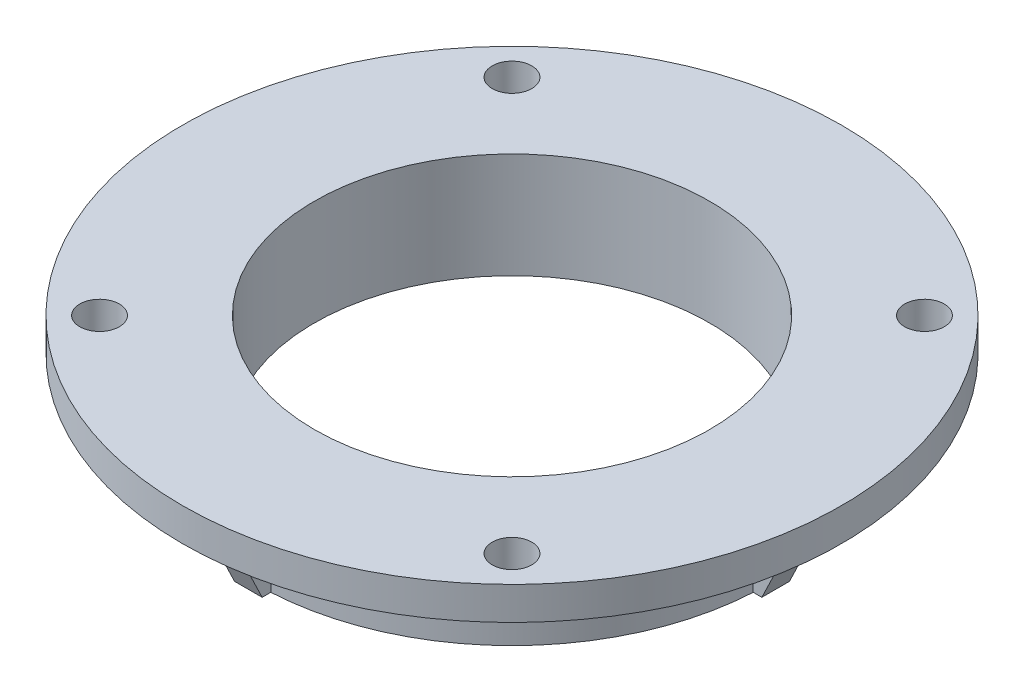
ISO-10303-21;
HEADER;
FILE_DESCRIPTION(('STEP AP214'),'2;1');
FILE_NAME('part.step','',(''),(''),'','','');
FILE_SCHEMA(('AUTOMOTIVE_DESIGN { 1 0 10303 214 1 1 1 1 }'));
ENDSEC;
DATA;
#1=APPLICATION_CONTEXT('core data for automotive mechanical design processes');
#2=APPLICATION_PROTOCOL_DEFINITION('international standard','automotive_design',2000,#1);
#3=PRODUCT_CONTEXT('',#1,'mechanical');
#4=PRODUCT('Part','Part','',(#3));
#5=PRODUCT_RELATED_PRODUCT_CATEGORY('part','',(#4));
#6=PRODUCT_DEFINITION_FORMATION('','',#4);
#7=PRODUCT_DEFINITION_CONTEXT('part definition',#1,'design');
#8=PRODUCT_DEFINITION('design','',#6,#7);
#9=PRODUCT_DEFINITION_SHAPE('','',#8);
#10=(LENGTH_UNIT() NAMED_UNIT(*) SI_UNIT(.MILLI.,.METRE.));
#11=(NAMED_UNIT(*) PLANE_ANGLE_UNIT() SI_UNIT($,.RADIAN.));
#12=(NAMED_UNIT(*) SI_UNIT($,.STERADIAN.) SOLID_ANGLE_UNIT());
#13=UNCERTAINTY_MEASURE_WITH_UNIT(LENGTH_MEASURE(1.E-05),#10,'distance_accuracy_value','');
#14=(GEOMETRIC_REPRESENTATION_CONTEXT(3) GLOBAL_UNCERTAINTY_ASSIGNED_CONTEXT((#13)) GLOBAL_UNIT_ASSIGNED_CONTEXT((#10,
#11,#12)) REPRESENTATION_CONTEXT('',''));
#15=CARTESIAN_POINT('',(0.,0.,0.));
#16=DIRECTION('',(0.,0.,1.));
#17=DIRECTION('',(1.,0.,0.));
#18=AXIS2_PLACEMENT_3D('',#15,#16,#17);
#19=CARTESIAN_POINT('',(0.,22.,0.));
#20=DIRECTION('',(0.,1.,0.));
#21=DIRECTION('',(0.,0.,1.));
#22=AXIS2_PLACEMENT_3D('',#19,#20,#21);
#23=PLANE('',#22);
#24=CARTESIAN_POINT('',(62.5789501350076,22.,62.5789501350113));
#25=DIRECTION('',(0.,-1.,0.));
#26=DIRECTION('',(0.,0.,-1.));
#27=AXIS2_PLACEMENT_3D('',#24,#25,#26);
#28=CIRCLE('',#27,6.00000000000038);
#29=CARTESIAN_POINT('',(62.5789501350076,22.,56.5789501350109));
#30=VERTEX_POINT('',#29);
#31=EDGE_CURVE('E659',#30,#30,#28,.T.);
#32=ORIENTED_EDGE('',*,*,#31,.F.);
#33=EDGE_LOOP('',(#32));
#34=FACE_BOUND('',#33,.T.);
#35=CARTESIAN_POINT('',(-62.5789501350101,22.,62.5789501350108));
#36=DIRECTION('',(0.,-1.,0.));
#37=DIRECTION('',(0.,0.,-1.));
#38=AXIS2_PLACEMENT_3D('',#35,#36,#37);
#39=CIRCLE('',#38,5.99999999999999);
#40=CARTESIAN_POINT('',(-62.5789501350101,22.,56.5789501350108));
#41=VERTEX_POINT('',#40);
#42=EDGE_CURVE('E661',#41,#41,#39,.T.);
#43=ORIENTED_EDGE('',*,*,#42,.F.);
#44=EDGE_LOOP('',(#43));
#45=FACE_BOUND('',#44,.T.);
#46=CARTESIAN_POINT('',(-62.5789501350101,22.,-62.5789501350074));
#47=DIRECTION('',(0.,-1.,0.));
#48=DIRECTION('',(0.,0.,-1.));
#49=AXIS2_PLACEMENT_3D('',#46,#47,#48);
#50=CIRCLE('',#49,5.9999999999997);
#51=CARTESIAN_POINT('',(-62.5789501350101,22.,-68.5789501350071));
#52=VERTEX_POINT('',#51);
#53=EDGE_CURVE('E669',#52,#52,#50,.T.);
#54=ORIENTED_EDGE('',*,*,#53,.F.);
#55=EDGE_LOOP('',(#54));
#56=FACE_BOUND('',#55,.T.);
#57=CARTESIAN_POINT('',(62.5789501350076,22.,-62.5789501350069));
#58=DIRECTION('',(0.,-1.,0.));
#59=DIRECTION('',(0.,0.,-1.));
#60=AXIS2_PLACEMENT_3D('',#57,#58,#59);
#61=CIRCLE('',#60,6.00000000000148);
#62=CARTESIAN_POINT('',(62.5789501350076,22.,-68.5789501350084));
#63=VERTEX_POINT('',#62);
#64=EDGE_CURVE('E180',#63,#63,#61,.T.);
#65=ORIENTED_EDGE('',*,*,#64,.F.);
#66=EDGE_LOOP('',(#65));
#67=FACE_BOUND('',#66,.T.);
#68=CARTESIAN_POINT('',(0.,22.,0.));
#69=DIRECTION('',(0.,1.,0.));
#70=DIRECTION('',(0.,0.,1.));
#71=AXIS2_PLACEMENT_3D('',#68,#69,#70);
#72=CIRCLE('',#71,100.);
#73=CARTESIAN_POINT('',(0.,22.,100.));
#74=VERTEX_POINT('',#73);
#75=EDGE_CURVE('E265',#74,#74,#72,.T.);
#76=ORIENTED_EDGE('',*,*,#75,.F.);
#77=EDGE_LOOP('',(#76));
#78=FACE_BOUND('',#77,.T.);
#79=DIRECTION('',(0.,0.,-1.));
#80=VECTOR('',#79,1.);
#81=CARTESIAN_POINT('',(-90.6019093954514,22.,4.19000000000095));
#82=LINE('',#81,#80);
#83=CARTESIAN_POINT('',(-90.6019093954514,22.,4.19000000000095));
#84=VERTEX_POINT('',#83);
#85=CARTESIAN_POINT('',(-90.6019093954515,22.,-4.18999999999905));
#86=VERTEX_POINT('',#85);
#87=EDGE_CURVE('E174',#84,#86,#82,.T.);
#88=ORIENTED_EDGE('',*,*,#87,.F.);
#89=DIRECTION('',(-1.,0.,0.));
#90=VECTOR('',#89,1.);
#91=CARTESIAN_POINT('',(100.002,22.,4.18999999999892));
#92=LINE('',#91,#90);
#93=CARTESIAN_POINT('',(-77.3866519498033,22.,4.19000000000078));
#94=VERTEX_POINT('',#93);
#95=EDGE_CURVE('E51',#94,#84,#92,.T.);
#96=ORIENTED_EDGE('',*,*,#95,.F.);
#97=CARTESIAN_POINT('',(0.,22.,0.));
#98=DIRECTION('',(0.,1.,0.));
#99=DIRECTION('',(0.,0.,1.));
#100=AXIS2_PLACEMENT_3D('',#97,#98,#99);
#101=CIRCLE('',#100,77.5);
#102=CARTESIAN_POINT('',(-4.18999999999996,22.,77.3866519498033));
#103=VERTEX_POINT('',#102);
#104=EDGE_CURVE('E44',#94,#103,#101,.T.);
#105=ORIENTED_EDGE('',*,*,#104,.T.);
#106=DIRECTION('',(0.,0.,1.));
#107=VECTOR('',#106,1.);
#108=CARTESIAN_POINT('',(-4.18999999999997,22.,-100.002));
#109=LINE('',#108,#107);
#110=CARTESIAN_POINT('',(-4.19,22.,90.6019093954514));
#111=VERTEX_POINT('',#110);
#112=EDGE_CURVE('E257',#103,#111,#109,.T.);
#113=ORIENTED_EDGE('',*,*,#112,.T.);
#114=DIRECTION('',(-1.,0.,0.));
#115=VECTOR('',#114,1.);
#116=CARTESIAN_POINT('',(4.19,22.,90.6019093954514));
#117=LINE('',#116,#115);
#118=CARTESIAN_POINT('',(4.19,22.,90.6019093954514));
#119=VERTEX_POINT('',#118);
#120=EDGE_CURVE('E207',#119,#111,#117,.T.);
#121=ORIENTED_EDGE('',*,*,#120,.F.);
#122=DIRECTION('',(0.,0.,1.));
#123=VECTOR('',#122,1.);
#124=CARTESIAN_POINT('',(4.18999999999997,22.,-100.002));
#125=LINE('',#124,#123);
#126=CARTESIAN_POINT('',(4.18999999999996,22.,77.3866519498033));
#127=VERTEX_POINT('',#126);
#128=EDGE_CURVE('E259',#127,#119,#125,.T.);
#129=ORIENTED_EDGE('',*,*,#128,.F.);
#130=CARTESIAN_POINT('',(77.3866519498033,22.,4.18999999999969));
#131=VERTEX_POINT('',#130);
#132=EDGE_CURVE('E11',#127,#131,#101,.T.);
#133=ORIENTED_EDGE('',*,*,#132,.T.);
#134=DIRECTION('',(1.,0.,0.));
#135=VECTOR('',#134,1.);
#136=CARTESIAN_POINT('',(-100.002,22.,4.19000000000032));
#137=LINE('',#136,#135);
#138=CARTESIAN_POINT('',(90.6019093954514,22.,4.18999999999968));
#139=VERTEX_POINT('',#138);
#140=EDGE_CURVE('E237',#131,#139,#137,.T.);
#141=ORIENTED_EDGE('',*,*,#140,.T.);
#142=DIRECTION('',(0.,0.,1.));
#143=VECTOR('',#142,1.);
#144=CARTESIAN_POINT('',(90.6019093954514,22.,-4.19000000000032));
#145=LINE('',#144,#143);
#146=CARTESIAN_POINT('',(90.6019093954514,22.,-4.19000000000032));
#147=VERTEX_POINT('',#146);
#148=EDGE_CURVE('E198',#147,#139,#145,.T.);
#149=ORIENTED_EDGE('',*,*,#148,.F.);
#150=DIRECTION('',(1.,0.,0.));
#151=VECTOR('',#150,1.);
#152=CARTESIAN_POINT('',(-100.002,22.,-4.18999999999962));
#153=LINE('',#152,#151);
#154=CARTESIAN_POINT('',(77.3866519498033,22.,-4.19000000000023));
#155=VERTEX_POINT('',#154);
#156=EDGE_CURVE('E243',#155,#147,#153,.T.);
#157=ORIENTED_EDGE('',*,*,#156,.F.);
#158=CARTESIAN_POINT('',(4.18999999999996,22.,-77.3866519498033));
#159=VERTEX_POINT('',#158);
#160=EDGE_CURVE('E42',#155,#159,#101,.T.);
#161=ORIENTED_EDGE('',*,*,#160,.T.);
#162=DIRECTION('',(0.,0.,-1.));
#163=VECTOR('',#162,1.);
#164=CARTESIAN_POINT('',(4.18999999999997,22.,100.002));
#165=LINE('',#164,#163);
#166=CARTESIAN_POINT('',(4.19,22.,-90.6019093954514));
#167=VERTEX_POINT('',#166);
#168=EDGE_CURVE('E221',#159,#167,#165,.T.);
#169=ORIENTED_EDGE('',*,*,#168,.T.);
#170=DIRECTION('',(1.,0.,0.));
#171=VECTOR('',#170,1.);
#172=CARTESIAN_POINT('',(-4.19,22.,-90.6019093954514));
#173=LINE('',#172,#171);
#174=CARTESIAN_POINT('',(-4.19,22.,-90.6019093954514));
#175=VERTEX_POINT('',#174);
#176=EDGE_CURVE('E189',#175,#167,#173,.T.);
#177=ORIENTED_EDGE('',*,*,#176,.F.);
#178=DIRECTION('',(0.,0.,-1.));
#179=VECTOR('',#178,1.);
#180=CARTESIAN_POINT('',(-4.18999999999997,22.,100.002));
#181=LINE('',#180,#179);
#182=CARTESIAN_POINT('',(-4.18999999999996,22.,-77.3866519498033));
#183=VERTEX_POINT('',#182);
#184=EDGE_CURVE('E227',#183,#175,#181,.T.);
#185=ORIENTED_EDGE('',*,*,#184,.F.);
#186=CARTESIAN_POINT('',(-77.3866519498034,22.,-4.18999999999915));
#187=VERTEX_POINT('',#186);
#188=EDGE_CURVE('E311',#183,#187,#101,.T.);
#189=ORIENTED_EDGE('',*,*,#188,.T.);
#190=DIRECTION('',(-1.,0.,0.));
#191=VECTOR('',#190,1.);
#192=CARTESIAN_POINT('',(100.002,22.,-4.19000000000101));
#193=LINE('',#192,#191);
#194=EDGE_CURVE('E58',#187,#86,#193,.T.);
#195=ORIENTED_EDGE('',*,*,#194,.T.);
#196=EDGE_LOOP('',(#88,#96,#105,#113,#121,#129,#133,#141,#149,#157,#161,#169,#177,#185,#189,#195));
#197=FACE_BOUND('',#196,.T.);
#198=ADVANCED_FACE('F33',(#34,#45,#56,#67,#78,#197),#23,.F.);
#199=CARTESIAN_POINT('',(-70.,10.,0.));
#200=DIRECTION('',(0.,-1.,0.));
#201=DIRECTION('',(0.,0.,-1.));
#202=AXIS2_PLACEMENT_3D('',#199,#200,#201);
#203=CYLINDRICAL_SURFACE('',#202,4.19);
#204=CARTESIAN_POINT('',(-70.,10.,0.));
#205=DIRECTION('',(0.,1.,0.));
#206=DIRECTION('',(0.,0.,1.));
#207=AXIS2_PLACEMENT_3D('',#204,#205,#206);
#208=CIRCLE('',#207,4.19);
#209=CARTESIAN_POINT('',(-70.,10.,4.19));
#210=VERTEX_POINT('',#209);
#211=EDGE_CURVE('E273',#210,#210,#208,.T.);
#212=ORIENTED_EDGE('',*,*,#211,.T.);
#213=EDGE_LOOP('',(#212));
#214=FACE_BOUND('',#213,.T.);
#215=CARTESIAN_POINT('',(-70.,0.,0.));
#216=DIRECTION('',(0.,1.,0.));
#217=DIRECTION('',(0.,0.,1.));
#218=AXIS2_PLACEMENT_3D('',#215,#216,#217);
#219=CIRCLE('',#218,4.19);
#220=CARTESIAN_POINT('',(-70.,0.,4.19));
#221=VERTEX_POINT('',#220);
#222=EDGE_CURVE('E277',#221,#221,#219,.T.);
#223=ORIENTED_EDGE('',*,*,#222,.F.);
#224=EDGE_LOOP('',(#223));
#225=FACE_BOUND('',#224,.T.);
#226=ADVANCED_FACE('F354',(#214,#225),#203,.F.);
#227=CARTESIAN_POINT('',(0.,10.,0.));
#228=DIRECTION('',(0.,1.,0.));
#229=DIRECTION('',(0.,0.,1.));
#230=AXIS2_PLACEMENT_3D('',#227,#228,#229);
#231=PLANE('',#230);
#232=ORIENTED_EDGE('',*,*,#211,.F.);
#233=EDGE_LOOP('',(#232));
#234=FACE_BOUND('',#233,.T.);
#235=ADVANCED_FACE('F362',(#234),#231,.F.);
#236=CARTESIAN_POINT('',(0.,10.,-70.));
#237=DIRECTION('',(0.,-1.,0.));
#238=DIRECTION('',(0.,0.,-1.));
#239=AXIS2_PLACEMENT_3D('',#236,#237,#238);
#240=CYLINDRICAL_SURFACE('',#239,4.18999999999999);
#241=CARTESIAN_POINT('',(0.,10.,-70.));
#242=DIRECTION('',(0.,1.,0.));
#243=DIRECTION('',(0.,0.,1.));
#244=AXIS2_PLACEMENT_3D('',#241,#242,#243);
#245=CIRCLE('',#244,4.18999999999999);
#246=CARTESIAN_POINT('',(0.,10.,-65.81));
#247=VERTEX_POINT('',#246);
#248=EDGE_CURVE('E284',#247,#247,#245,.T.);
#249=ORIENTED_EDGE('',*,*,#248,.T.);
#250=EDGE_LOOP('',(#249));
#251=FACE_BOUND('',#250,.T.);
#252=CARTESIAN_POINT('',(0.,0.,-70.));
#253=DIRECTION('',(0.,1.,0.));
#254=DIRECTION('',(0.,0.,1.));
#255=AXIS2_PLACEMENT_3D('',#252,#253,#254);
#256=CIRCLE('',#255,4.18999999999999);
#257=CARTESIAN_POINT('',(0.,0.,-65.81));
#258=VERTEX_POINT('',#257);
#259=EDGE_CURVE('E292',#258,#258,#256,.T.);
#260=ORIENTED_EDGE('',*,*,#259,.F.);
#261=EDGE_LOOP('',(#260));
#262=FACE_BOUND('',#261,.T.);
#263=ADVANCED_FACE('F394',(#251,#262),#240,.F.);
#264=ORIENTED_EDGE('',*,*,#248,.F.);
#265=EDGE_LOOP('',(#264));
#266=FACE_BOUND('',#265,.T.);
#267=ADVANCED_FACE('F392',(#266),#231,.F.);
#268=CARTESIAN_POINT('',(70.,10.,0.));
#269=DIRECTION('',(0.,-1.,0.));
#270=DIRECTION('',(0.,0.,-1.));
#271=AXIS2_PLACEMENT_3D('',#268,#269,#270);
#272=CYLINDRICAL_SURFACE('',#271,4.19);
#273=CARTESIAN_POINT('',(70.,10.,0.));
#274=DIRECTION('',(0.,1.,0.));
#275=DIRECTION('',(0.,0.,1.));
#276=AXIS2_PLACEMENT_3D('',#273,#274,#275);
#277=CIRCLE('',#276,4.19);
#278=CARTESIAN_POINT('',(70.,10.,4.19000000000003));
#279=VERTEX_POINT('',#278);
#280=EDGE_CURVE('E276',#279,#279,#277,.T.);
#281=ORIENTED_EDGE('',*,*,#280,.T.);
#282=EDGE_LOOP('',(#281));
#283=FACE_BOUND('',#282,.T.);
#284=CARTESIAN_POINT('',(70.,0.,0.));
#285=DIRECTION('',(0.,1.,0.));
#286=DIRECTION('',(0.,0.,1.));
#287=AXIS2_PLACEMENT_3D('',#284,#285,#286);
#288=CIRCLE('',#287,4.19);
#289=CARTESIAN_POINT('',(70.,0.,4.19000000000003));
#290=VERTEX_POINT('',#289);
#291=EDGE_CURVE('E287',#290,#290,#288,.T.);
#292=ORIENTED_EDGE('',*,*,#291,.F.);
#293=EDGE_LOOP('',(#292));
#294=FACE_BOUND('',#293,.T.);
#295=ADVANCED_FACE('F389',(#283,#294),#272,.F.);
#296=ORIENTED_EDGE('',*,*,#280,.F.);
#297=EDGE_LOOP('',(#296));
#298=FACE_BOUND('',#297,.T.);
#299=ADVANCED_FACE('F384',(#298),#231,.F.);
#300=CARTESIAN_POINT('',(0.,10.,70.));
#301=DIRECTION('',(0.,-1.,0.));
#302=DIRECTION('',(0.,0.,-1.));
#303=AXIS2_PLACEMENT_3D('',#300,#301,#302);
#304=CYLINDRICAL_SURFACE('',#303,4.18999999999999);
#305=CARTESIAN_POINT('',(0.,10.,70.));
#306=DIRECTION('',(0.,1.,0.));
#307=DIRECTION('',(0.,0.,1.));
#308=AXIS2_PLACEMENT_3D('',#305,#306,#307);
#309=CIRCLE('',#308,4.18999999999999);
#310=CARTESIAN_POINT('',(0.,10.,74.19));
#311=VERTEX_POINT('',#310);
#312=EDGE_CURVE('E281',#311,#311,#309,.T.);
#313=ORIENTED_EDGE('',*,*,#312,.T.);
#314=EDGE_LOOP('',(#313));
#315=FACE_BOUND('',#314,.T.);
#316=CARTESIAN_POINT('',(0.,0.,70.));
#317=DIRECTION('',(0.,1.,0.));
#318=DIRECTION('',(0.,0.,1.));
#319=AXIS2_PLACEMENT_3D('',#316,#317,#318);
#320=CIRCLE('',#319,4.18999999999999);
#321=CARTESIAN_POINT('',(0.,0.,74.19));
#322=VERTEX_POINT('',#321);
#323=EDGE_CURVE('E280',#322,#322,#320,.T.);
#324=ORIENTED_EDGE('',*,*,#323,.F.);
#325=EDGE_LOOP('',(#324));
#326=FACE_BOUND('',#325,.T.);
#327=ADVANCED_FACE('F382',(#315,#326),#304,.F.);
#328=ORIENTED_EDGE('',*,*,#312,.F.);
#329=EDGE_LOOP('',(#328));
#330=FACE_BOUND('',#329,.T.);
#331=ADVANCED_FACE('F379',(#330),#231,.F.);
#332=CARTESIAN_POINT('',(0.,10.,0.));
#333=DIRECTION('',(0.,-1.,0.));
#334=DIRECTION('',(0.,0.,-1.));
#335=AXIS2_PLACEMENT_3D('',#332,#333,#334);
#336=CYLINDRICAL_SURFACE('',#335,77.5);
#337=ORIENTED_EDGE('',*,*,#104,.F.);
#338=DIRECTION('',(0.,-1.,0.));
#339=VECTOR('',#338,1.);
#340=CARTESIAN_POINT('',(-77.3866519498033,10.,4.19000000000078));
#341=LINE('',#340,#339);
#342=CARTESIAN_POINT('',(-77.3866519498032,0.,4.19000000000078));
#343=VERTEX_POINT('',#342);
#344=EDGE_CURVE('E171',#343,#94,#341,.F.);
#345=ORIENTED_EDGE('',*,*,#344,.F.);
#346=CARTESIAN_POINT('',(0.,0.,0.));
#347=DIRECTION('',(0.,1.,0.));
#348=DIRECTION('',(0.,0.,1.));
#349=AXIS2_PLACEMENT_3D('',#346,#347,#348);
#350=CIRCLE('',#349,77.5);
#351=CARTESIAN_POINT('',(-4.18999999999996,0.,77.3866519498033));
#352=VERTEX_POINT('',#351);
#353=EDGE_CURVE('E298',#343,#352,#350,.T.);
#354=ORIENTED_EDGE('',*,*,#353,.T.);
#355=DIRECTION('',(0.,-1.,0.));
#356=VECTOR('',#355,1.);
#357=CARTESIAN_POINT('',(-4.18999999999996,10.,77.3866519498033));
#358=LINE('',#357,#356);
#359=EDGE_CURVE('E236',#103,#352,#358,.T.);
#360=ORIENTED_EDGE('',*,*,#359,.F.);
#361=EDGE_LOOP('',(#337,#345,#354,#360));
#362=FACE_BOUND('',#361,.T.);
#363=ADVANCED_FACE('F381',(#362),#336,.T.);
#364=CARTESIAN_POINT('',(-4.18999999999997,0.,-77.3866519498033));
#365=VERTEX_POINT('',#364);
#366=CARTESIAN_POINT('',(-77.3866519498034,0.,-4.18999999999915));
#367=VERTEX_POINT('',#366);
#368=EDGE_CURVE('E301',#365,#367,#350,.T.);
#369=ORIENTED_EDGE('',*,*,#368,.T.);
#370=DIRECTION('',(0.,-1.,0.));
#371=VECTOR('',#370,1.);
#372=CARTESIAN_POINT('',(-77.3866519498034,10.,-4.18999999999915));
#373=LINE('',#372,#371);
#374=EDGE_CURVE('E170',#187,#367,#373,.T.);
#375=ORIENTED_EDGE('',*,*,#374,.F.);
#376=ORIENTED_EDGE('',*,*,#188,.F.);
#377=DIRECTION('',(0.,-1.,0.));
#378=VECTOR('',#377,1.);
#379=CARTESIAN_POINT('',(-4.18999999999997,10.,-77.3866519498033));
#380=LINE('',#379,#378);
#381=EDGE_CURVE('E222',#365,#183,#380,.F.);
#382=ORIENTED_EDGE('',*,*,#381,.F.);
#383=EDGE_LOOP('',(#369,#375,#376,#382));
#384=FACE_BOUND('',#383,.T.);
#385=ADVANCED_FACE('F334',(#384),#336,.T.);
#386=CARTESIAN_POINT('',(77.3866519498032,0.,-4.19000000000024));
#387=VERTEX_POINT('',#386);
#388=CARTESIAN_POINT('',(4.18999999999996,0.,-77.3866519498033));
#389=VERTEX_POINT('',#388);
#390=EDGE_CURVE('E306',#387,#389,#350,.T.);
#391=ORIENTED_EDGE('',*,*,#390,.T.);
#392=DIRECTION('',(0.,-1.,0.));
#393=VECTOR('',#392,1.);
#394=CARTESIAN_POINT('',(4.18999999999996,10.,-77.3866519498033));
#395=LINE('',#394,#393);
#396=EDGE_CURVE('E163',#159,#389,#395,.T.);
#397=ORIENTED_EDGE('',*,*,#396,.F.);
#398=ORIENTED_EDGE('',*,*,#160,.F.);
#399=DIRECTION('',(0.,-1.,0.));
#400=VECTOR('',#399,1.);
#401=CARTESIAN_POINT('',(77.3866519498033,10.,-4.19000000000024));
#402=LINE('',#401,#400);
#403=EDGE_CURVE('E238',#387,#155,#402,.F.);
#404=ORIENTED_EDGE('',*,*,#403,.F.);
#405=EDGE_LOOP('',(#391,#397,#398,#404));
#406=FACE_BOUND('',#405,.T.);
#407=ADVANCED_FACE('F317',(#406),#336,.T.);
#408=CARTESIAN_POINT('',(4.18999999999997,0.,77.3866519498033));
#409=VERTEX_POINT('',#408);
#410=CARTESIAN_POINT('',(77.3866519498033,0.,4.18999999999969));
#411=VERTEX_POINT('',#410);
#412=EDGE_CURVE('E37',#409,#411,#350,.T.);
#413=ORIENTED_EDGE('',*,*,#412,.T.);
#414=DIRECTION('',(0.,-1.,0.));
#415=VECTOR('',#414,1.);
#416=CARTESIAN_POINT('',(77.3866519498033,10.,4.18999999999969));
#417=LINE('',#416,#415);
#418=EDGE_CURVE('E220',#131,#411,#417,.T.);
#419=ORIENTED_EDGE('',*,*,#418,.F.);
#420=ORIENTED_EDGE('',*,*,#132,.F.);
#421=DIRECTION('',(0.,-1.,0.));
#422=VECTOR('',#421,1.);
#423=CARTESIAN_POINT('',(4.18999999999997,10.,77.3866519498033));
#424=LINE('',#423,#422);
#425=EDGE_CURVE('E250',#409,#127,#424,.F.);
#426=ORIENTED_EDGE('',*,*,#425,.F.);
#427=EDGE_LOOP('',(#413,#419,#420,#426));
#428=FACE_BOUND('',#427,.T.);
#429=ADVANCED_FACE('F35',(#428),#336,.T.);
#430=CARTESIAN_POINT('',(0.,0.,0.));
#431=DIRECTION('',(0.,1.,0.));
#432=DIRECTION('',(0.,0.,1.));
#433=AXIS2_PLACEMENT_3D('',#430,#431,#432);
#434=PLANE('',#433);
#435=ORIENTED_EDGE('',*,*,#412,.F.);
#436=DIRECTION('',(0.,0.,1.));
#437=VECTOR('',#436,1.);
#438=CARTESIAN_POINT('',(4.18999999999997,0.,-100.002));
#439=LINE('',#438,#437);
#440=CARTESIAN_POINT('',(4.18999999999997,0.,80.));
#441=VERTEX_POINT('',#440);
#442=EDGE_CURVE('E261',#409,#441,#439,.T.);
#443=ORIENTED_EDGE('',*,*,#442,.T.);
#444=DIRECTION('',(1.,0.,0.));
#445=VECTOR('',#444,1.);
#446=CARTESIAN_POINT('',(4.18999999999997,0.,80.));
#447=LINE('',#446,#445);
#448=CARTESIAN_POINT('',(-4.19,0.,80.));
#449=VERTEX_POINT('',#448);
#450=EDGE_CURVE('E253',#449,#441,#447,.T.);
#451=ORIENTED_EDGE('',*,*,#450,.F.);
#452=DIRECTION('',(0.,0.,1.));
#453=VECTOR('',#452,1.);
#454=CARTESIAN_POINT('',(-4.18999999999996,0.,-100.002));
#455=LINE('',#454,#453);
#456=EDGE_CURVE('E252',#352,#449,#455,.T.);
#457=ORIENTED_EDGE('',*,*,#456,.F.);
#458=ORIENTED_EDGE('',*,*,#353,.F.);
#459=DIRECTION('',(-1.,0.,0.));
#460=VECTOR('',#459,1.);
#461=CARTESIAN_POINT('',(100.002,0.,4.18999999999892));
#462=LINE('',#461,#460);
#463=CARTESIAN_POINT('',(-80.,0.,4.19000000000081));
#464=VERTEX_POINT('',#463);
#465=EDGE_CURVE('E159',#343,#464,#462,.T.);
#466=ORIENTED_EDGE('',*,*,#465,.T.);
#467=DIRECTION('',(0.,0.,1.));
#468=VECTOR('',#467,1.);
#469=CARTESIAN_POINT('',(-80.,0.,4.19000000000081));
#470=LINE('',#469,#468);
#471=CARTESIAN_POINT('',(-80.,0.,-4.18999999999916));
#472=VERTEX_POINT('',#471);
#473=EDGE_CURVE('E150',#472,#464,#470,.T.);
#474=ORIENTED_EDGE('',*,*,#473,.F.);
#475=DIRECTION('',(-1.,0.,0.));
#476=VECTOR('',#475,1.);
#477=CARTESIAN_POINT('',(100.002,0.,-4.19000000000101));
#478=LINE('',#477,#476);
#479=EDGE_CURVE('E156',#367,#472,#478,.T.);
#480=ORIENTED_EDGE('',*,*,#479,.F.);
#481=ORIENTED_EDGE('',*,*,#368,.F.);
#482=DIRECTION('',(0.,0.,-1.));
#483=VECTOR('',#482,1.);
#484=CARTESIAN_POINT('',(-4.18999999999997,0.,100.002));
#485=LINE('',#484,#483);
#486=CARTESIAN_POINT('',(-4.18999999999997,0.,-80.));
#487=VERTEX_POINT('',#486);
#488=EDGE_CURVE('E229',#365,#487,#485,.T.);
#489=ORIENTED_EDGE('',*,*,#488,.T.);
#490=DIRECTION('',(-1.,0.,0.));
#491=VECTOR('',#490,1.);
#492=CARTESIAN_POINT('',(-4.18999999999997,0.,-80.));
#493=LINE('',#492,#491);
#494=CARTESIAN_POINT('',(4.19,0.,-80.));
#495=VERTEX_POINT('',#494);
#496=EDGE_CURVE('E217',#495,#487,#493,.T.);
#497=ORIENTED_EDGE('',*,*,#496,.F.);
#498=DIRECTION('',(0.,0.,-1.));
#499=VECTOR('',#498,1.);
#500=CARTESIAN_POINT('',(4.18999999999996,0.,100.002));
#501=LINE('',#500,#499);
#502=EDGE_CURVE('E224',#389,#495,#501,.T.);
#503=ORIENTED_EDGE('',*,*,#502,.F.);
#504=ORIENTED_EDGE('',*,*,#390,.F.);
#505=DIRECTION('',(1.,0.,0.));
#506=VECTOR('',#505,1.);
#507=CARTESIAN_POINT('',(-100.002,0.,-4.18999999999962));
#508=LINE('',#507,#506);
#509=CARTESIAN_POINT('',(80.,0.,-4.19000000000025));
#510=VERTEX_POINT('',#509);
#511=EDGE_CURVE('E245',#387,#510,#508,.T.);
#512=ORIENTED_EDGE('',*,*,#511,.T.);
#513=DIRECTION('',(0.,0.,-1.));
#514=VECTOR('',#513,1.);
#515=CARTESIAN_POINT('',(80.,0.,-4.19000000000025));
#516=LINE('',#515,#514);
#517=CARTESIAN_POINT('',(80.,0.,4.18999999999972));
#518=VERTEX_POINT('',#517);
#519=EDGE_CURVE('E233',#518,#510,#516,.T.);
#520=ORIENTED_EDGE('',*,*,#519,.F.);
#521=DIRECTION('',(1.,0.,0.));
#522=VECTOR('',#521,1.);
#523=CARTESIAN_POINT('',(-100.002,0.,4.19000000000031));
#524=LINE('',#523,#522);
#525=EDGE_CURVE('E240',#411,#518,#524,.T.);
#526=ORIENTED_EDGE('',*,*,#525,.F.);
#527=EDGE_LOOP('',(#435,#443,#451,#457,#458,#466,#474,#480,#481,#489,#497,#503,#504,#512,#520,#526));
#528=FACE_BOUND('',#527,.T.);
#529=CARTESIAN_POINT('',(0.,0.,0.));
#530=DIRECTION('',(0.,1.,0.));
#531=DIRECTION('',(0.,0.,1.));
#532=AXIS2_PLACEMENT_3D('',#529,#530,#531);
#533=CIRCLE('',#532,60.);
#534=CARTESIAN_POINT('',(0.,0.,60.));
#535=VERTEX_POINT('',#534);
#536=EDGE_CURVE('E296',#535,#535,#533,.T.);
#537=ORIENTED_EDGE('',*,*,#536,.T.);
#538=EDGE_LOOP('',(#537));
#539=FACE_BOUND('',#538,.T.);
#540=ORIENTED_EDGE('',*,*,#259,.T.);
#541=EDGE_LOOP('',(#540));
#542=FACE_BOUND('',#541,.T.);
#543=ORIENTED_EDGE('',*,*,#291,.T.);
#544=EDGE_LOOP('',(#543));
#545=FACE_BOUND('',#544,.T.);
#546=ORIENTED_EDGE('',*,*,#323,.T.);
#547=EDGE_LOOP('',(#546));
#548=FACE_BOUND('',#547,.T.);
#549=ORIENTED_EDGE('',*,*,#222,.T.);
#550=EDGE_LOOP('',(#549));
#551=FACE_BOUND('',#550,.T.);
#552=ADVANCED_FACE('F153',(#528,#539,#542,#545,#548,#551),#434,.F.);
#553=CARTESIAN_POINT('',(0.,10.,0.));
#554=DIRECTION('',(0.,-1.,0.));
#555=DIRECTION('',(0.,0.,-1.));
#556=AXIS2_PLACEMENT_3D('',#553,#554,#555);
#557=CYLINDRICAL_SURFACE('',#556,60.);
#558=CARTESIAN_POINT('',(0.,32.,0.));
#559=DIRECTION('',(0.,1.,0.));
#560=DIRECTION('',(0.,0.,1.));
#561=AXIS2_PLACEMENT_3D('',#558,#559,#560);
#562=CIRCLE('',#561,60.);
#563=CARTESIAN_POINT('',(0.,32.,60.));
#564=VERTEX_POINT('',#563);
#565=EDGE_CURVE('E268',#564,#564,#562,.T.);
#566=ORIENTED_EDGE('',*,*,#565,.T.);
#567=EDGE_LOOP('',(#566));
#568=FACE_BOUND('',#567,.T.);
#569=ORIENTED_EDGE('',*,*,#536,.F.);
#570=EDGE_LOOP('',(#569));
#571=FACE_BOUND('',#570,.T.);
#572=ADVANCED_FACE('F377',(#568,#571),#557,.F.);
#573=CARTESIAN_POINT('',(0.,32.,0.));
#574=DIRECTION('',(0.,1.,0.));
#575=DIRECTION('',(0.,0.,1.));
#576=AXIS2_PLACEMENT_3D('',#573,#574,#575);
#577=PLANE('',#576);
#578=CARTESIAN_POINT('',(62.5789501350076,32.,62.5789501350113));
#579=DIRECTION('',(0.,-1.,0.));
#580=DIRECTION('',(0.,0.,-1.));
#581=AXIS2_PLACEMENT_3D('',#578,#579,#580);
#582=CIRCLE('',#581,6.00000000000038);
#583=CARTESIAN_POINT('',(62.5789501350076,32.,56.5789501350109));
#584=VERTEX_POINT('',#583);
#585=EDGE_CURVE('E657',#584,#584,#582,.T.);
#586=ORIENTED_EDGE('',*,*,#585,.T.);
#587=EDGE_LOOP('',(#586));
#588=FACE_BOUND('',#587,.T.);
#589=CARTESIAN_POINT('',(-62.5789501350101,32.,62.5789501350108));
#590=DIRECTION('',(0.,-1.,0.));
#591=DIRECTION('',(0.,0.,-1.));
#592=AXIS2_PLACEMENT_3D('',#589,#590,#591);
#593=CIRCLE('',#592,5.99999999999999);
#594=CARTESIAN_POINT('',(-62.5789501350101,32.,56.5789501350108));
#595=VERTEX_POINT('',#594);
#596=EDGE_CURVE('E674',#595,#595,#593,.T.);
#597=ORIENTED_EDGE('',*,*,#596,.T.);
#598=EDGE_LOOP('',(#597));
#599=FACE_BOUND('',#598,.T.);
#600=CARTESIAN_POINT('',(-62.5789501350101,32.,-62.5789501350074));
#601=DIRECTION('',(0.,-1.,0.));
#602=DIRECTION('',(0.,0.,-1.));
#603=AXIS2_PLACEMENT_3D('',#600,#601,#602);
#604=CIRCLE('',#603,5.9999999999997);
#605=CARTESIAN_POINT('',(-62.5789501350101,32.,-68.5789501350071));
#606=VERTEX_POINT('',#605);
#607=EDGE_CURVE('E665',#606,#606,#604,.T.);
#608=ORIENTED_EDGE('',*,*,#607,.T.);
#609=EDGE_LOOP('',(#608));
#610=FACE_BOUND('',#609,.T.);
#611=CARTESIAN_POINT('',(62.5789501350076,32.,-62.5789501350069));
#612=DIRECTION('',(0.,-1.,0.));
#613=DIRECTION('',(0.,0.,-1.));
#614=AXIS2_PLACEMENT_3D('',#611,#612,#613);
#615=CIRCLE('',#614,6.00000000000148);
#616=CARTESIAN_POINT('',(62.5789501350076,32.,-68.5789501350084));
#617=VERTEX_POINT('',#616);
#618=EDGE_CURVE('E176',#617,#617,#615,.T.);
#619=ORIENTED_EDGE('',*,*,#618,.T.);
#620=EDGE_LOOP('',(#619));
#621=FACE_BOUND('',#620,.T.);
#622=ORIENTED_EDGE('',*,*,#565,.F.);
#623=EDGE_LOOP('',(#622));
#624=FACE_BOUND('',#623,.T.);
#625=CARTESIAN_POINT('',(0.,32.,0.));
#626=DIRECTION('',(0.,1.,0.));
#627=DIRECTION('',(0.,0.,1.));
#628=AXIS2_PLACEMENT_3D('',#625,#626,#627);
#629=CIRCLE('',#628,100.);
#630=CARTESIAN_POINT('',(0.,32.,100.));
#631=VERTEX_POINT('',#630);
#632=EDGE_CURVE('E256',#631,#631,#629,.T.);
#633=ORIENTED_EDGE('',*,*,#632,.T.);
#634=EDGE_LOOP('',(#633));
#635=FACE_BOUND('',#634,.T.);
#636=ADVANCED_FACE('F374',(#588,#599,#610,#621,#624,#635),#577,.T.);
#637=CARTESIAN_POINT('',(0.,22.,0.));
#638=DIRECTION('',(0.,1.,0.));
#639=DIRECTION('',(0.,0.,1.));
#640=AXIS2_PLACEMENT_3D('',#637,#638,#639);
#641=CYLINDRICAL_SURFACE('',#640,100.);
#642=ORIENTED_EDGE('',*,*,#75,.T.);
#643=EDGE_LOOP('',(#642));
#644=FACE_BOUND('',#643,.T.);
#645=ORIENTED_EDGE('',*,*,#632,.F.);
#646=EDGE_LOOP('',(#645));
#647=FACE_BOUND('',#646,.T.);
#648=ADVANCED_FACE('F371',(#644,#647),#641,.T.);
#649=CARTESIAN_POINT('',(4.18999999999997,0.,-100.002));
#650=DIRECTION('',(1.,0.,0.));
#651=DIRECTION('',(0.,1.,0.));
#652=AXIS2_PLACEMENT_3D('',#649,#650,#651);
#653=PLANE('',#652);
#654=ORIENTED_EDGE('',*,*,#425,.T.);
#655=ORIENTED_EDGE('',*,*,#128,.T.);
#656=DIRECTION('',(0.,0.900852499003792,0.434125298777464));
#657=VECTOR('',#656,1.);
#658=CARTESIAN_POINT('',(4.19,0.,80.));
#659=LINE('',#658,#657);
#660=EDGE_CURVE('E204',#441,#119,#659,.T.);
#661=ORIENTED_EDGE('',*,*,#660,.F.);
#662=ORIENTED_EDGE('',*,*,#442,.F.);
#663=EDGE_LOOP('',(#654,#655,#661,#662));
#664=FACE_BOUND('',#663,.T.);
#665=ADVANCED_FACE('F349',(#664),#653,.T.);
#666=CARTESIAN_POINT('',(-4.18999999999996,0.,-100.002));
#667=DIRECTION('',(-1.,0.,0.));
#668=DIRECTION('',(0.,-1.,0.));
#669=AXIS2_PLACEMENT_3D('',#666,#667,#668);
#670=PLANE('',#669);
#671=ORIENTED_EDGE('',*,*,#456,.T.);
#672=DIRECTION('',(0.,0.900852499003792,0.434125298777464));
#673=VECTOR('',#672,1.);
#674=CARTESIAN_POINT('',(-4.19,0.,80.));
#675=LINE('',#674,#673);
#676=EDGE_CURVE('E203',#449,#111,#675,.T.);
#677=ORIENTED_EDGE('',*,*,#676,.T.);
#678=ORIENTED_EDGE('',*,*,#112,.F.);
#679=ORIENTED_EDGE('',*,*,#359,.T.);
#680=EDGE_LOOP('',(#671,#677,#678,#679));
#681=FACE_BOUND('',#680,.T.);
#682=ADVANCED_FACE('F369',(#681),#670,.T.);
#683=CARTESIAN_POINT('',(-100.002,0.,-4.18999999999962));
#684=DIRECTION('',(0.,0.,-1.));
#685=DIRECTION('',(-1.,0.,0.));
#686=AXIS2_PLACEMENT_3D('',#683,#684,#685);
#687=PLANE('',#686);
#688=ORIENTED_EDGE('',*,*,#403,.T.);
#689=ORIENTED_EDGE('',*,*,#156,.T.);
#690=DIRECTION('',(0.434125298777464,0.900852499003792,0.));
#691=VECTOR('',#690,1.);
#692=CARTESIAN_POINT('',(80.,0.,-4.19000000000028));
#693=LINE('',#692,#691);
#694=EDGE_CURVE('E195',#510,#147,#693,.T.);
#695=ORIENTED_EDGE('',*,*,#694,.F.);
#696=ORIENTED_EDGE('',*,*,#511,.F.);
#697=EDGE_LOOP('',(#688,#689,#695,#696));
#698=FACE_BOUND('',#697,.T.);
#699=ADVANCED_FACE('F346',(#698),#687,.T.);
#700=CARTESIAN_POINT('',(-100.002,0.,4.19000000000031));
#701=DIRECTION('',(0.,0.,1.));
#702=DIRECTION('',(1.,0.,0.));
#703=AXIS2_PLACEMENT_3D('',#700,#701,#702);
#704=PLANE('',#703);
#705=ORIENTED_EDGE('',*,*,#525,.T.);
#706=DIRECTION('',(0.434125298777464,0.900852499003792,0.));
#707=VECTOR('',#706,1.);
#708=CARTESIAN_POINT('',(80.,0.,4.18999999999972));
#709=LINE('',#708,#707);
#710=EDGE_CURVE('E194',#518,#139,#709,.T.);
#711=ORIENTED_EDGE('',*,*,#710,.T.);
#712=ORIENTED_EDGE('',*,*,#140,.F.);
#713=ORIENTED_EDGE('',*,*,#418,.T.);
#714=EDGE_LOOP('',(#705,#711,#712,#713));
#715=FACE_BOUND('',#714,.T.);
#716=ADVANCED_FACE('F338',(#715),#704,.T.);
#717=CARTESIAN_POINT('',(-4.18999999999997,0.,100.002));
#718=DIRECTION('',(-1.,0.,0.));
#719=DIRECTION('',(0.,-1.,0.));
#720=AXIS2_PLACEMENT_3D('',#717,#718,#719);
#721=PLANE('',#720);
#722=ORIENTED_EDGE('',*,*,#381,.T.);
#723=ORIENTED_EDGE('',*,*,#184,.T.);
#724=DIRECTION('',(0.,0.900852499003792,-0.434125298777464));
#725=VECTOR('',#724,1.);
#726=CARTESIAN_POINT('',(-4.19,0.,-80.));
#727=LINE('',#726,#725);
#728=EDGE_CURVE('E186',#487,#175,#727,.T.);
#729=ORIENTED_EDGE('',*,*,#728,.F.);
#730=ORIENTED_EDGE('',*,*,#488,.F.);
#731=EDGE_LOOP('',(#722,#723,#729,#730));
#732=FACE_BOUND('',#731,.T.);
#733=ADVANCED_FACE('F336',(#732),#721,.T.);
#734=CARTESIAN_POINT('',(4.18999999999996,0.,100.002));
#735=DIRECTION('',(1.,0.,0.));
#736=DIRECTION('',(0.,1.,0.));
#737=AXIS2_PLACEMENT_3D('',#734,#735,#736);
#738=PLANE('',#737);
#739=ORIENTED_EDGE('',*,*,#502,.T.);
#740=DIRECTION('',(0.,0.900852499003792,-0.434125298777464));
#741=VECTOR('',#740,1.);
#742=CARTESIAN_POINT('',(4.19,0.,-80.));
#743=LINE('',#742,#741);
#744=EDGE_CURVE('E185',#495,#167,#743,.T.);
#745=ORIENTED_EDGE('',*,*,#744,.T.);
#746=ORIENTED_EDGE('',*,*,#168,.F.);
#747=ORIENTED_EDGE('',*,*,#396,.T.);
#748=EDGE_LOOP('',(#739,#745,#746,#747));
#749=FACE_BOUND('',#748,.T.);
#750=ADVANCED_FACE('F323',(#749),#738,.T.);
#751=CARTESIAN_POINT('',(100.002,0.,4.18999999999892));
#752=DIRECTION('',(0.,0.,1.));
#753=DIRECTION('',(1.,0.,0.));
#754=AXIS2_PLACEMENT_3D('',#751,#752,#753);
#755=PLANE('',#754);
#756=ORIENTED_EDGE('',*,*,#344,.T.);
#757=ORIENTED_EDGE('',*,*,#95,.T.);
#758=DIRECTION('',(-0.434125298777464,0.900852499003792,0.));
#759=VECTOR('',#758,1.);
#760=CARTESIAN_POINT('',(-80.,0.,4.19000000000084));
#761=LINE('',#760,#759);
#762=EDGE_CURVE('E175',#464,#84,#761,.T.);
#763=ORIENTED_EDGE('',*,*,#762,.F.);
#764=ORIENTED_EDGE('',*,*,#465,.F.);
#765=EDGE_LOOP('',(#756,#757,#763,#764));
#766=FACE_BOUND('',#765,.T.);
#767=ADVANCED_FACE('F344',(#766),#755,.T.);
#768=CARTESIAN_POINT('',(100.002,0.,-4.19000000000101));
#769=DIRECTION('',(0.,0.,-1.));
#770=DIRECTION('',(-1.,0.,0.));
#771=AXIS2_PLACEMENT_3D('',#768,#769,#770);
#772=PLANE('',#771);
#773=ORIENTED_EDGE('',*,*,#479,.T.);
#774=DIRECTION('',(-0.434125298777464,0.900852499003792,0.));
#775=VECTOR('',#774,1.);
#776=CARTESIAN_POINT('',(-80.,0.,-4.18999999999916));
#777=LINE('',#776,#775);
#778=EDGE_CURVE('E168',#472,#86,#777,.T.);
#779=ORIENTED_EDGE('',*,*,#778,.T.);
#780=ORIENTED_EDGE('',*,*,#194,.F.);
#781=ORIENTED_EDGE('',*,*,#374,.T.);
#782=EDGE_LOOP('',(#773,#779,#780,#781));
#783=FACE_BOUND('',#782,.T.);
#784=ADVANCED_FACE('F167',(#783),#772,.T.);
#785=CARTESIAN_POINT('',(4.19,0.,80.));
#786=DIRECTION('',(0.,-0.434125298777464,0.900852499003792));
#787=DIRECTION('',(0.,-0.900852499003792,-0.434125298777464));
#788=AXIS2_PLACEMENT_3D('',#785,#786,#787);
#789=PLANE('',#788);
#790=ORIENTED_EDGE('',*,*,#676,.F.);
#791=ORIENTED_EDGE('',*,*,#450,.T.);
#792=ORIENTED_EDGE('',*,*,#660,.T.);
#793=ORIENTED_EDGE('',*,*,#120,.T.);
#794=EDGE_LOOP('',(#790,#791,#792,#793));
#795=FACE_BOUND('',#794,.T.);
#796=ADVANCED_FACE('F352',(#795),#789,.T.);
#797=CARTESIAN_POINT('',(80.,0.,-4.19000000000028));
#798=DIRECTION('',(0.900852499003792,-0.434125298777464,0.));
#799=DIRECTION('',(0.434125298777464,0.900852499003792,0.));
#800=AXIS2_PLACEMENT_3D('',#797,#798,#799);
#801=PLANE('',#800);
#802=ORIENTED_EDGE('',*,*,#710,.F.);
#803=ORIENTED_EDGE('',*,*,#519,.T.);
#804=ORIENTED_EDGE('',*,*,#694,.T.);
#805=ORIENTED_EDGE('',*,*,#148,.T.);
#806=EDGE_LOOP('',(#802,#803,#804,#805));
#807=FACE_BOUND('',#806,.T.);
#808=ADVANCED_FACE('F425',(#807),#801,.T.);
#809=CARTESIAN_POINT('',(-4.19,0.,-80.));
#810=DIRECTION('',(0.,-0.434125298777464,-0.900852499003792));
#811=DIRECTION('',(0.,0.900852499003792,-0.434125298777464));
#812=AXIS2_PLACEMENT_3D('',#809,#810,#811);
#813=PLANE('',#812);
#814=ORIENTED_EDGE('',*,*,#744,.F.);
#815=ORIENTED_EDGE('',*,*,#496,.T.);
#816=ORIENTED_EDGE('',*,*,#728,.T.);
#817=ORIENTED_EDGE('',*,*,#176,.T.);
#818=EDGE_LOOP('',(#814,#815,#816,#817));
#819=FACE_BOUND('',#818,.T.);
#820=ADVANCED_FACE('F325',(#819),#813,.T.);
#821=CARTESIAN_POINT('',(-80.,0.,4.19000000000084));
#822=DIRECTION('',(-0.900852499003792,-0.434125298777464,0.));
#823=DIRECTION('',(0.434125298777464,-0.900852499003792,0.));
#824=AXIS2_PLACEMENT_3D('',#821,#822,#823);
#825=PLANE('',#824);
#826=ORIENTED_EDGE('',*,*,#778,.F.);
#827=ORIENTED_EDGE('',*,*,#473,.T.);
#828=ORIENTED_EDGE('',*,*,#762,.T.);
#829=ORIENTED_EDGE('',*,*,#87,.T.);
#830=EDGE_LOOP('',(#826,#827,#828,#829));
#831=FACE_BOUND('',#830,.T.);
#832=ADVANCED_FACE('F173',(#831),#825,.T.);
#833=CARTESIAN_POINT('',(62.5789501350076,32.,-62.5789501350069));
#834=DIRECTION('',(0.,-1.,0.));
#835=DIRECTION('',(0.,0.,-1.));
#836=AXIS2_PLACEMENT_3D('',#833,#834,#835);
#837=CYLINDRICAL_SURFACE('',#836,6.00000000000148);
#838=ORIENTED_EDGE('',*,*,#618,.F.);
#839=EDGE_LOOP('',(#838));
#840=FACE_BOUND('',#839,.T.);
#841=ORIENTED_EDGE('',*,*,#64,.T.);
#842=EDGE_LOOP('',(#841));
#843=FACE_BOUND('',#842,.T.);
#844=ADVANCED_FACE('F549',(#840,#843),#837,.F.);
#845=CARTESIAN_POINT('',(-62.5789501350101,32.,-62.5789501350074));
#846=DIRECTION('',(0.,-1.,0.));
#847=DIRECTION('',(0.,0.,-1.));
#848=AXIS2_PLACEMENT_3D('',#845,#846,#847);
#849=CYLINDRICAL_SURFACE('',#848,5.9999999999997);
#850=ORIENTED_EDGE('',*,*,#607,.F.);
#851=EDGE_LOOP('',(#850));
#852=FACE_BOUND('',#851,.T.);
#853=ORIENTED_EDGE('',*,*,#53,.T.);
#854=EDGE_LOOP('',(#853));
#855=FACE_BOUND('',#854,.T.);
#856=ADVANCED_FACE('F621',(#852,#855),#849,.F.);
#857=CARTESIAN_POINT('',(-62.5789501350101,32.,62.5789501350108));
#858=DIRECTION('',(0.,-1.,0.));
#859=DIRECTION('',(0.,0.,-1.));
#860=AXIS2_PLACEMENT_3D('',#857,#858,#859);
#861=CYLINDRICAL_SURFACE('',#860,5.99999999999999);
#862=ORIENTED_EDGE('',*,*,#596,.F.);
#863=EDGE_LOOP('',(#862));
#864=FACE_BOUND('',#863,.T.);
#865=ORIENTED_EDGE('',*,*,#42,.T.);
#866=EDGE_LOOP('',(#865));
#867=FACE_BOUND('',#866,.T.);
#868=ADVANCED_FACE('F630',(#864,#867),#861,.F.);
#869=CARTESIAN_POINT('',(62.5789501350076,32.,62.5789501350113));
#870=DIRECTION('',(0.,-1.,0.));
#871=DIRECTION('',(0.,0.,-1.));
#872=AXIS2_PLACEMENT_3D('',#869,#870,#871);
#873=CYLINDRICAL_SURFACE('',#872,6.00000000000038);
#874=ORIENTED_EDGE('',*,*,#585,.F.);
#875=EDGE_LOOP('',(#874));
#876=FACE_BOUND('',#875,.T.);
#877=ORIENTED_EDGE('',*,*,#31,.T.);
#878=EDGE_LOOP('',(#877));
#879=FACE_BOUND('',#878,.T.);
#880=ADVANCED_FACE('F639',(#876,#879),#873,.F.);
#881=CLOSED_SHELL('',(#198,#226,#235,#263,#267,#295,#299,#327,#331,#363,#385,#407,#429,#552,
#572,#636,#648,#665,#682,#699,#716,#733,#750,#767,#784,#796,#808,#820,#832,#844,#856,#868,#880));
#882=MANIFOLD_SOLID_BREP('B2',#881);
#883=ADVANCED_BREP_SHAPE_REPRESENTATION('',(#18,#882),#14);
#884=SHAPE_DEFINITION_REPRESENTATION(#9,#883);
ENDSEC;
END-ISO-10303-21;
